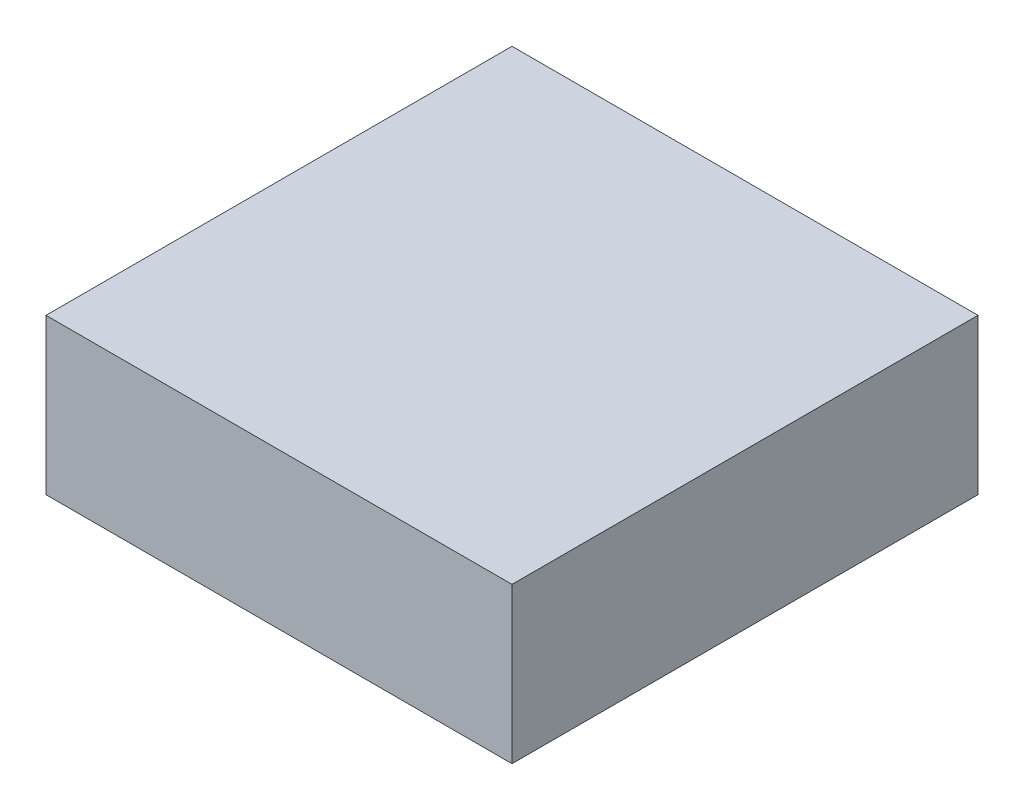
ISO-10303-21;
HEADER;
FILE_DESCRIPTION(('STEP AP214'),'2;1');
FILE_NAME('part.step','',(''),(''),'','','');
FILE_SCHEMA(('AUTOMOTIVE_DESIGN { 1 0 10303 214 1 1 1 1 }'));
ENDSEC;
DATA;
#1=APPLICATION_CONTEXT('core data for automotive mechanical design processes');
#2=APPLICATION_PROTOCOL_DEFINITION('international standard','automotive_design',2000,#1);
#3=PRODUCT_CONTEXT('',#1,'mechanical');
#4=PRODUCT('Part','Part','',(#3));
#5=PRODUCT_RELATED_PRODUCT_CATEGORY('part','',(#4));
#6=PRODUCT_DEFINITION_FORMATION('','',#4);
#7=PRODUCT_DEFINITION_CONTEXT('part definition',#1,'design');
#8=PRODUCT_DEFINITION('design','',#6,#7);
#9=PRODUCT_DEFINITION_SHAPE('','',#8);
#10=(LENGTH_UNIT() NAMED_UNIT(*) SI_UNIT(.MILLI.,.METRE.));
#11=(NAMED_UNIT(*) PLANE_ANGLE_UNIT() SI_UNIT($,.RADIAN.));
#12=(NAMED_UNIT(*) SI_UNIT($,.STERADIAN.) SOLID_ANGLE_UNIT());
#13=UNCERTAINTY_MEASURE_WITH_UNIT(LENGTH_MEASURE(1.E-05),#10,'distance_accuracy_value','');
#14=(GEOMETRIC_REPRESENTATION_CONTEXT(3) GLOBAL_UNCERTAINTY_ASSIGNED_CONTEXT((#13)) GLOBAL_UNIT_ASSIGNED_CONTEXT((#10,
#11,#12)) REPRESENTATION_CONTEXT('',''));
#15=CARTESIAN_POINT('',(0.,0.,0.));
#16=DIRECTION('',(0.,0.,1.));
#17=DIRECTION('',(1.,0.,0.));
#18=AXIS2_PLACEMENT_3D('',#15,#16,#17);
#19=CARTESIAN_POINT('',(-3.33333333333333,30.,-80.));
#20=DIRECTION('',(0.,0.,1.));
#21=DIRECTION('',(1.,0.,0.));
#22=AXIS2_PLACEMENT_3D('',#19,#20,#21);
#23=PLANE('',#22);
#24=DIRECTION('',(-1.,0.,0.));
#25=VECTOR('',#24,1.);
#26=CARTESIAN_POINT('',(-3.33333333333333,0.,-80.));
#27=LINE('',#26,#25);
#28=CARTESIAN_POINT('',(86.6666666666667,0.,-80.));
#29=VERTEX_POINT('',#28);
#30=CARTESIAN_POINT('',(-3.33333333333333,0.,-80.));
#31=VERTEX_POINT('',#30);
#32=EDGE_CURVE('E98',#29,#31,#27,.T.);
#33=ORIENTED_EDGE('',*,*,#32,.T.);
#34=DIRECTION('',(0.,-1.,0.));
#35=VECTOR('',#34,1.);
#36=CARTESIAN_POINT('',(-3.33333333333333,30.,-80.));
#37=LINE('',#36,#35);
#38=CARTESIAN_POINT('',(-3.33333333333333,30.,-80.));
#39=VERTEX_POINT('',#38);
#40=EDGE_CURVE('E11',#39,#31,#37,.T.);
#41=ORIENTED_EDGE('',*,*,#40,.F.);
#42=DIRECTION('',(-1.,0.,0.));
#43=VECTOR('',#42,1.);
#44=CARTESIAN_POINT('',(-3.33333333333333,30.,-80.));
#45=LINE('',#44,#43);
#46=CARTESIAN_POINT('',(86.6666666666667,30.,-80.));
#47=VERTEX_POINT('',#46);
#48=EDGE_CURVE('E86',#47,#39,#45,.T.);
#49=ORIENTED_EDGE('',*,*,#48,.F.);
#50=DIRECTION('',(0.,-1.,0.));
#51=VECTOR('',#50,1.);
#52=CARTESIAN_POINT('',(86.6666666666667,30.,-80.));
#53=LINE('',#52,#51);
#54=EDGE_CURVE('E94',#47,#29,#53,.T.);
#55=ORIENTED_EDGE('',*,*,#54,.T.);
#56=EDGE_LOOP('',(#33,#41,#49,#55));
#57=FACE_BOUND('',#56,.T.);
#58=ADVANCED_FACE('F35',(#57),#23,.F.);
#59=CARTESIAN_POINT('',(-3.33333333333333,30.,-80.));
#60=DIRECTION('',(1.,0.,0.));
#61=DIRECTION('',(0.,0.,-1.));
#62=AXIS2_PLACEMENT_3D('',#59,#60,#61);
#63=PLANE('',#62);
#64=DIRECTION('',(0.,0.,1.));
#65=VECTOR('',#64,1.);
#66=CARTESIAN_POINT('',(-3.33333333333333,0.,-80.));
#67=LINE('',#66,#65);
#68=CARTESIAN_POINT('',(-3.33333333333333,0.,10.));
#69=VERTEX_POINT('',#68);
#70=EDGE_CURVE('E90',#31,#69,#67,.T.);
#71=ORIENTED_EDGE('',*,*,#70,.T.);
#72=DIRECTION('',(0.,-1.,0.));
#73=VECTOR('',#72,1.);
#74=CARTESIAN_POINT('',(-3.33333333333333,30.,10.));
#75=LINE('',#74,#73);
#76=CARTESIAN_POINT('',(-3.33333333333333,30.,10.));
#77=VERTEX_POINT('',#76);
#78=EDGE_CURVE('E43',#77,#69,#75,.T.);
#79=ORIENTED_EDGE('',*,*,#78,.F.);
#80=DIRECTION('',(0.,0.,1.));
#81=VECTOR('',#80,1.);
#82=CARTESIAN_POINT('',(-3.33333333333333,30.,-80.));
#83=LINE('',#82,#81);
#84=EDGE_CURVE('E81',#39,#77,#83,.T.);
#85=ORIENTED_EDGE('',*,*,#84,.F.);
#86=ORIENTED_EDGE('',*,*,#40,.T.);
#87=EDGE_LOOP('',(#71,#79,#85,#86));
#88=FACE_BOUND('',#87,.T.);
#89=ADVANCED_FACE('F89',(#88),#63,.F.);
#90=CARTESIAN_POINT('',(-3.33333333333333,30.,10.));
#91=DIRECTION('',(0.,0.,-1.));
#92=DIRECTION('',(-1.,0.,0.));
#93=AXIS2_PLACEMENT_3D('',#90,#91,#92);
#94=PLANE('',#93);
#95=DIRECTION('',(1.,0.,0.));
#96=VECTOR('',#95,1.);
#97=CARTESIAN_POINT('',(-3.33333333333333,0.,10.));
#98=LINE('',#97,#96);
#99=CARTESIAN_POINT('',(86.6666666666667,0.,10.));
#100=VERTEX_POINT('',#99);
#101=EDGE_CURVE('E68',#69,#100,#98,.T.);
#102=ORIENTED_EDGE('',*,*,#101,.T.);
#103=DIRECTION('',(0.,-1.,0.));
#104=VECTOR('',#103,1.);
#105=CARTESIAN_POINT('',(86.6666666666667,30.,10.));
#106=LINE('',#105,#104);
#107=CARTESIAN_POINT('',(86.6666666666667,30.,10.));
#108=VERTEX_POINT('',#107);
#109=EDGE_CURVE('E91',#108,#100,#106,.T.);
#110=ORIENTED_EDGE('',*,*,#109,.F.);
#111=DIRECTION('',(1.,0.,0.));
#112=VECTOR('',#111,1.);
#113=CARTESIAN_POINT('',(-3.33333333333333,30.,10.));
#114=LINE('',#113,#112);
#115=EDGE_CURVE('E84',#77,#108,#114,.T.);
#116=ORIENTED_EDGE('',*,*,#115,.F.);
#117=ORIENTED_EDGE('',*,*,#78,.T.);
#118=EDGE_LOOP('',(#102,#110,#116,#117));
#119=FACE_BOUND('',#118,.T.);
#120=ADVANCED_FACE('F92',(#119),#94,.F.);
#121=CARTESIAN_POINT('',(86.6666666666667,30.,-80.));
#122=DIRECTION('',(-1.,0.,0.));
#123=DIRECTION('',(0.,0.,1.));
#124=AXIS2_PLACEMENT_3D('',#121,#122,#123);
#125=PLANE('',#124);
#126=DIRECTION('',(0.,0.,-1.));
#127=VECTOR('',#126,1.);
#128=CARTESIAN_POINT('',(86.6666666666667,0.,-80.));
#129=LINE('',#128,#127);
#130=EDGE_CURVE('E74',#100,#29,#129,.T.);
#131=ORIENTED_EDGE('',*,*,#130,.T.);
#132=ORIENTED_EDGE('',*,*,#54,.F.);
#133=DIRECTION('',(0.,0.,-1.));
#134=VECTOR('',#133,1.);
#135=CARTESIAN_POINT('',(86.6666666666667,30.,-80.));
#136=LINE('',#135,#134);
#137=EDGE_CURVE('E51',#108,#47,#136,.T.);
#138=ORIENTED_EDGE('',*,*,#137,.F.);
#139=ORIENTED_EDGE('',*,*,#109,.T.);
#140=EDGE_LOOP('',(#131,#132,#138,#139));
#141=FACE_BOUND('',#140,.T.);
#142=ADVANCED_FACE('F105',(#141),#125,.F.);
#143=CARTESIAN_POINT('',(0.,30.,0.));
#144=DIRECTION('',(0.,-1.,0.));
#145=DIRECTION('',(0.,0.,-1.));
#146=AXIS2_PLACEMENT_3D('',#143,#144,#145);
#147=PLANE('',#146);
#148=ORIENTED_EDGE('',*,*,#48,.T.);
#149=ORIENTED_EDGE('',*,*,#84,.T.);
#150=ORIENTED_EDGE('',*,*,#115,.T.);
#151=ORIENTED_EDGE('',*,*,#137,.T.);
#152=EDGE_LOOP('',(#148,#149,#150,#151));
#153=FACE_BOUND('',#152,.T.);
#154=ADVANCED_FACE('F82',(#153),#147,.F.);
#155=CARTESIAN_POINT('',(0.,0.,0.));
#156=DIRECTION('',(0.,-1.,0.));
#157=DIRECTION('',(0.,0.,-1.));
#158=AXIS2_PLACEMENT_3D('',#155,#156,#157);
#159=PLANE('',#158);
#160=ORIENTED_EDGE('',*,*,#32,.F.);
#161=ORIENTED_EDGE('',*,*,#130,.F.);
#162=ORIENTED_EDGE('',*,*,#101,.F.);
#163=ORIENTED_EDGE('',*,*,#70,.F.);
#164=EDGE_LOOP('',(#160,#161,#162,#163));
#165=FACE_BOUND('',#164,.T.);
#166=ADVANCED_FACE('F108',(#165),#159,.T.);
#167=CLOSED_SHELL('',(#58,#89,#120,#142,#154,#166));
#168=MANIFOLD_SOLID_BREP('B2',#167);
#169=ADVANCED_BREP_SHAPE_REPRESENTATION('',(#18,#168),#14);
#170=SHAPE_DEFINITION_REPRESENTATION(#9,#169);
ENDSEC;
END-ISO-10303-21;
